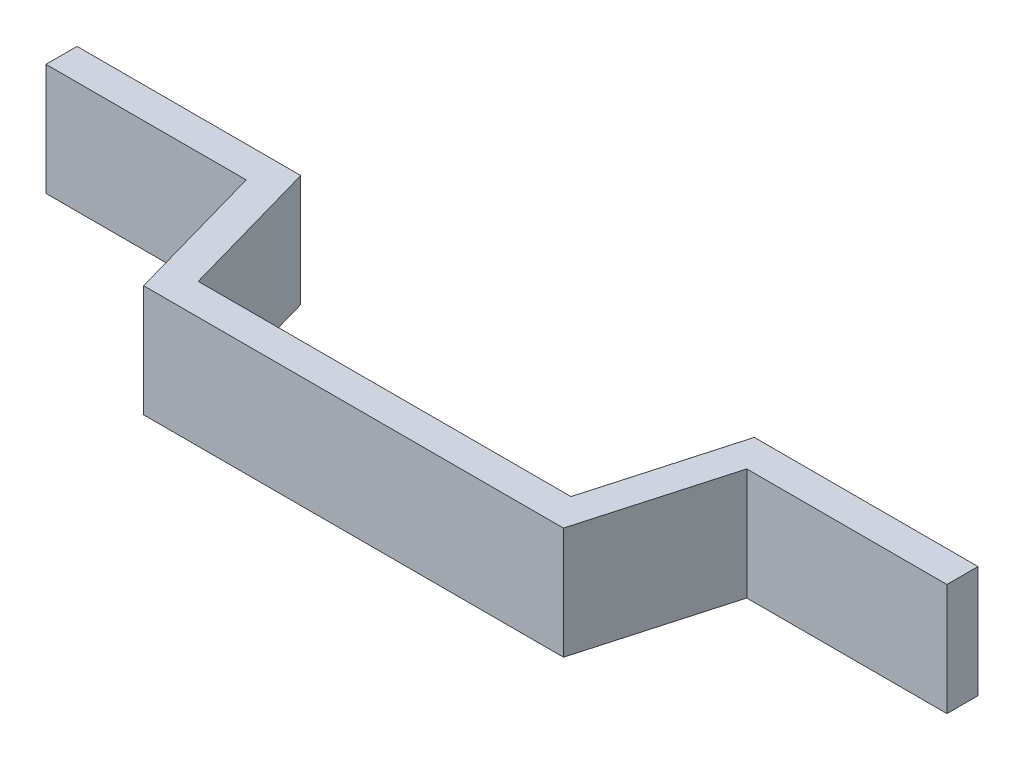
ISO-10303-21;
HEADER;
FILE_DESCRIPTION(('STEP AP214'),'2;1');
FILE_NAME('part.step','',(''),(''),'','','');
FILE_SCHEMA(('AUTOMOTIVE_DESIGN { 1 0 10303 214 1 1 1 1 }'));
ENDSEC;
DATA;
#1=APPLICATION_CONTEXT('core data for automotive mechanical design processes');
#2=APPLICATION_PROTOCOL_DEFINITION('international standard','automotive_design',2000,#1);
#3=PRODUCT_CONTEXT('',#1,'mechanical');
#4=PRODUCT('Part','Part','',(#3));
#5=PRODUCT_RELATED_PRODUCT_CATEGORY('part','',(#4));
#6=PRODUCT_DEFINITION_FORMATION('','',#4);
#7=PRODUCT_DEFINITION_CONTEXT('part definition',#1,'design');
#8=PRODUCT_DEFINITION('design','',#6,#7);
#9=PRODUCT_DEFINITION_SHAPE('','',#8);
#10=(LENGTH_UNIT() NAMED_UNIT(*) SI_UNIT(.MILLI.,.METRE.));
#11=(NAMED_UNIT(*) PLANE_ANGLE_UNIT() SI_UNIT($,.RADIAN.));
#12=(NAMED_UNIT(*) SI_UNIT($,.STERADIAN.) SOLID_ANGLE_UNIT());
#13=UNCERTAINTY_MEASURE_WITH_UNIT(LENGTH_MEASURE(1.E-05),#10,'distance_accuracy_value','');
#14=(GEOMETRIC_REPRESENTATION_CONTEXT(3) GLOBAL_UNCERTAINTY_ASSIGNED_CONTEXT((#13)) GLOBAL_UNIT_ASSIGNED_CONTEXT((#10,
#11,#12)) REPRESENTATION_CONTEXT('',''));
#15=CARTESIAN_POINT('',(0.,0.,0.));
#16=DIRECTION('',(0.,0.,1.));
#17=DIRECTION('',(1.,0.,0.));
#18=AXIS2_PLACEMENT_3D('',#15,#16,#17);
#19=CARTESIAN_POINT('',(-72.5,18.,-23.));
#20=DIRECTION('',(1.,0.,0.));
#21=DIRECTION('',(0.,0.,-1.));
#22=AXIS2_PLACEMENT_3D('',#19,#20,#21);
#23=PLANE('',#22);
#24=DIRECTION('',(0.,0.,1.));
#25=VECTOR('',#24,1.);
#26=CARTESIAN_POINT('',(-72.5,0.,-23.));
#27=LINE('',#26,#25);
#28=CARTESIAN_POINT('',(-72.5,0.,-28.));
#29=VERTEX_POINT('',#28);
#30=CARTESIAN_POINT('',(-72.5,0.,-23.));
#31=VERTEX_POINT('',#30);
#32=EDGE_CURVE('E163',#29,#31,#27,.T.);
#33=ORIENTED_EDGE('',*,*,#32,.T.);
#34=DIRECTION('',(0.,-1.,0.));
#35=VECTOR('',#34,1.);
#36=CARTESIAN_POINT('',(-72.5,18.,-23.));
#37=LINE('',#36,#35);
#38=CARTESIAN_POINT('',(-72.5,18.,-23.));
#39=VERTEX_POINT('',#38);
#40=EDGE_CURVE('E11',#39,#31,#37,.T.);
#41=ORIENTED_EDGE('',*,*,#40,.F.);
#42=DIRECTION('',(0.,0.,1.));
#43=VECTOR('',#42,1.);
#44=CARTESIAN_POINT('',(-72.5,18.,-23.));
#45=LINE('',#44,#43);
#46=CARTESIAN_POINT('',(-72.5,18.,-28.));
#47=VERTEX_POINT('',#46);
#48=EDGE_CURVE('E185',#47,#39,#45,.T.);
#49=ORIENTED_EDGE('',*,*,#48,.F.);
#50=DIRECTION('',(0.,-1.,0.));
#51=VECTOR('',#50,1.);
#52=CARTESIAN_POINT('',(-72.5,18.,-28.));
#53=LINE('',#52,#51);
#54=EDGE_CURVE('E159',#47,#29,#53,.T.);
#55=ORIENTED_EDGE('',*,*,#54,.T.);
#56=EDGE_LOOP('',(#33,#41,#49,#55));
#57=FACE_BOUND('',#56,.T.);
#58=ADVANCED_FACE('F43',(#57),#23,.F.);
#59=CARTESIAN_POINT('',(-40.282790609877,18.,-23.));
#60=DIRECTION('',(0.,0.,-1.));
#61=DIRECTION('',(-1.,0.,0.));
#62=AXIS2_PLACEMENT_3D('',#59,#60,#61);
#63=PLANE('',#62);
#64=DIRECTION('',(1.,0.,0.));
#65=VECTOR('',#64,1.);
#66=CARTESIAN_POINT('',(-40.282790609877,0.,-23.));
#67=LINE('',#66,#65);
#68=CARTESIAN_POINT('',(-40.282790609877,0.,-23.));
#69=VERTEX_POINT('',#68);
#70=EDGE_CURVE('E166',#31,#69,#67,.T.);
#71=ORIENTED_EDGE('',*,*,#70,.T.);
#72=DIRECTION('',(0.,-1.,0.));
#73=VECTOR('',#72,1.);
#74=CARTESIAN_POINT('',(-40.282790609877,18.,-23.));
#75=LINE('',#74,#73);
#76=CARTESIAN_POINT('',(-40.282790609877,18.,-23.));
#77=VERTEX_POINT('',#76);
#78=EDGE_CURVE('E51',#77,#69,#75,.T.);
#79=ORIENTED_EDGE('',*,*,#78,.F.);
#80=DIRECTION('',(1.,0.,0.));
#81=VECTOR('',#80,1.);
#82=CARTESIAN_POINT('',(-40.282790609877,18.,-23.));
#83=LINE('',#82,#81);
#84=EDGE_CURVE('E114',#39,#77,#83,.T.);
#85=ORIENTED_EDGE('',*,*,#84,.F.);
#86=ORIENTED_EDGE('',*,*,#40,.T.);
#87=EDGE_LOOP('',(#71,#79,#85,#86));
#88=FACE_BOUND('',#87,.T.);
#89=ADVANCED_FACE('F263',(#88),#63,.F.);
#90=CARTESIAN_POINT('',(-33.782790609877,18.,0.));
#91=DIRECTION('',(0.962309403107199,0.,-0.271957005225948));
#92=DIRECTION('',(-0.271957005225948,0.,-0.962309403107199));
#93=AXIS2_PLACEMENT_3D('',#90,#91,#92);
#94=PLANE('',#93);
#95=DIRECTION('',(0.271957005225948,0.,0.962309403107199));
#96=VECTOR('',#95,1.);
#97=CARTESIAN_POINT('',(-33.782790609877,0.,0.));
#98=LINE('',#97,#96);
#99=CARTESIAN_POINT('',(-33.782790609877,0.,0.));
#100=VERTEX_POINT('',#99);
#101=EDGE_CURVE('E168',#69,#100,#98,.T.);
#102=ORIENTED_EDGE('',*,*,#101,.T.);
#103=DIRECTION('',(0.,-1.,0.));
#104=VECTOR('',#103,1.);
#105=CARTESIAN_POINT('',(-33.782790609877,18.,0.));
#106=LINE('',#105,#104);
#107=CARTESIAN_POINT('',(-33.782790609877,18.,0.));
#108=VERTEX_POINT('',#107);
#109=EDGE_CURVE('E204',#108,#100,#106,.T.);
#110=ORIENTED_EDGE('',*,*,#109,.F.);
#111=DIRECTION('',(0.271957005225948,0.,0.962309403107199));
#112=VECTOR('',#111,1.);
#113=CARTESIAN_POINT('',(-33.782790609877,18.,0.));
#114=LINE('',#113,#112);
#115=EDGE_CURVE('E212',#77,#108,#114,.T.);
#116=ORIENTED_EDGE('',*,*,#115,.F.);
#117=ORIENTED_EDGE('',*,*,#78,.T.);
#118=EDGE_LOOP('',(#102,#110,#116,#117));
#119=FACE_BOUND('',#118,.T.);
#120=ADVANCED_FACE('F210',(#119),#94,.F.);
#121=CARTESIAN_POINT('',(33.782790609877,18.,0.));
#122=DIRECTION('',(0.,0.,-1.));
#123=DIRECTION('',(-1.,0.,0.));
#124=AXIS2_PLACEMENT_3D('',#121,#122,#123);
#125=PLANE('',#124);
#126=DIRECTION('',(1.,0.,0.));
#127=VECTOR('',#126,1.);
#128=CARTESIAN_POINT('',(33.782790609877,0.,0.));
#129=LINE('',#128,#127);
#130=CARTESIAN_POINT('',(33.782790609877,0.,0.));
#131=VERTEX_POINT('',#130);
#132=EDGE_CURVE('E170',#100,#131,#129,.T.);
#133=ORIENTED_EDGE('',*,*,#132,.T.);
#134=DIRECTION('',(0.,-1.,0.));
#135=VECTOR('',#134,1.);
#136=CARTESIAN_POINT('',(33.782790609877,18.,0.));
#137=LINE('',#136,#135);
#138=CARTESIAN_POINT('',(33.782790609877,18.,0.));
#139=VERTEX_POINT('',#138);
#140=EDGE_CURVE('E201',#139,#131,#137,.T.);
#141=ORIENTED_EDGE('',*,*,#140,.F.);
#142=DIRECTION('',(1.,0.,0.));
#143=VECTOR('',#142,1.);
#144=CARTESIAN_POINT('',(33.782790609877,18.,0.));
#145=LINE('',#144,#143);
#146=EDGE_CURVE('E230',#108,#139,#145,.T.);
#147=ORIENTED_EDGE('',*,*,#146,.F.);
#148=ORIENTED_EDGE('',*,*,#109,.T.);
#149=EDGE_LOOP('',(#133,#141,#147,#148));
#150=FACE_BOUND('',#149,.T.);
#151=ADVANCED_FACE('F221',(#150),#125,.F.);
#152=CARTESIAN_POINT('',(40.282790609877,18.,-23.));
#153=DIRECTION('',(-0.962309403107199,0.,-0.271957005225947));
#154=DIRECTION('',(-0.271957005225947,0.,0.962309403107199));
#155=AXIS2_PLACEMENT_3D('',#152,#153,#154);
#156=PLANE('',#155);
#157=DIRECTION('',(0.271957005225947,0.,-0.962309403107199));
#158=VECTOR('',#157,1.);
#159=CARTESIAN_POINT('',(40.282790609877,0.,-23.));
#160=LINE('',#159,#158);
#161=CARTESIAN_POINT('',(40.282790609877,0.,-23.));
#162=VERTEX_POINT('',#161);
#163=EDGE_CURVE('E172',#131,#162,#160,.T.);
#164=ORIENTED_EDGE('',*,*,#163,.T.);
#165=DIRECTION('',(0.,-1.,0.));
#166=VECTOR('',#165,1.);
#167=CARTESIAN_POINT('',(40.282790609877,18.,-23.));
#168=LINE('',#167,#166);
#169=CARTESIAN_POINT('',(40.282790609877,18.,-23.));
#170=VERTEX_POINT('',#169);
#171=EDGE_CURVE('E198',#170,#162,#168,.T.);
#172=ORIENTED_EDGE('',*,*,#171,.F.);
#173=DIRECTION('',(0.271957005225947,0.,-0.962309403107199));
#174=VECTOR('',#173,1.);
#175=CARTESIAN_POINT('',(40.282790609877,18.,-23.));
#176=LINE('',#175,#174);
#177=EDGE_CURVE('E227',#139,#170,#176,.T.);
#178=ORIENTED_EDGE('',*,*,#177,.F.);
#179=ORIENTED_EDGE('',*,*,#140,.T.);
#180=EDGE_LOOP('',(#164,#172,#178,#179));
#181=FACE_BOUND('',#180,.T.);
#182=ADVANCED_FACE('F225',(#181),#156,.F.);
#183=CARTESIAN_POINT('',(72.5,18.,-23.));
#184=DIRECTION('',(0.,0.,-1.));
#185=DIRECTION('',(-1.,0.,0.));
#186=AXIS2_PLACEMENT_3D('',#183,#184,#185);
#187=PLANE('',#186);
#188=DIRECTION('',(1.,0.,0.));
#189=VECTOR('',#188,1.);
#190=CARTESIAN_POINT('',(72.5,0.,-23.));
#191=LINE('',#190,#189);
#192=CARTESIAN_POINT('',(72.5,0.,-23.));
#193=VERTEX_POINT('',#192);
#194=EDGE_CURVE('E174',#162,#193,#191,.T.);
#195=ORIENTED_EDGE('',*,*,#194,.T.);
#196=DIRECTION('',(0.,-1.,0.));
#197=VECTOR('',#196,1.);
#198=CARTESIAN_POINT('',(72.5,18.,-23.));
#199=LINE('',#198,#197);
#200=CARTESIAN_POINT('',(72.5,18.,-23.));
#201=VERTEX_POINT('',#200);
#202=EDGE_CURVE('E195',#201,#193,#199,.T.);
#203=ORIENTED_EDGE('',*,*,#202,.F.);
#204=DIRECTION('',(1.,0.,0.));
#205=VECTOR('',#204,1.);
#206=CARTESIAN_POINT('',(72.5,18.,-23.));
#207=LINE('',#206,#205);
#208=EDGE_CURVE('E229',#170,#201,#207,.T.);
#209=ORIENTED_EDGE('',*,*,#208,.F.);
#210=ORIENTED_EDGE('',*,*,#171,.T.);
#211=EDGE_LOOP('',(#195,#203,#209,#210));
#212=FACE_BOUND('',#211,.T.);
#213=ADVANCED_FACE('F276',(#212),#187,.F.);
#214=CARTESIAN_POINT('',(72.5,18.,-28.));
#215=DIRECTION('',(-1.,0.,0.));
#216=DIRECTION('',(0.,0.,1.));
#217=AXIS2_PLACEMENT_3D('',#214,#215,#216);
#218=PLANE('',#217);
#219=DIRECTION('',(0.,0.,-1.));
#220=VECTOR('',#219,1.);
#221=CARTESIAN_POINT('',(72.5,0.,-28.));
#222=LINE('',#221,#220);
#223=CARTESIAN_POINT('',(72.5,0.,-28.));
#224=VERTEX_POINT('',#223);
#225=EDGE_CURVE('E176',#193,#224,#222,.T.);
#226=ORIENTED_EDGE('',*,*,#225,.T.);
#227=DIRECTION('',(0.,-1.,0.));
#228=VECTOR('',#227,1.);
#229=CARTESIAN_POINT('',(72.5,18.,-28.));
#230=LINE('',#229,#228);
#231=CARTESIAN_POINT('',(72.5,18.,-28.));
#232=VERTEX_POINT('',#231);
#233=EDGE_CURVE('E192',#232,#224,#230,.T.);
#234=ORIENTED_EDGE('',*,*,#233,.F.);
#235=DIRECTION('',(0.,0.,-1.));
#236=VECTOR('',#235,1.);
#237=CARTESIAN_POINT('',(72.5,18.,-28.));
#238=LINE('',#237,#236);
#239=EDGE_CURVE('E232',#201,#232,#238,.T.);
#240=ORIENTED_EDGE('',*,*,#239,.F.);
#241=ORIENTED_EDGE('',*,*,#202,.T.);
#242=EDGE_LOOP('',(#226,#234,#240,#241));
#243=FACE_BOUND('',#242,.T.);
#244=ADVANCED_FACE('F279',(#243),#218,.F.);
#245=CARTESIAN_POINT('',(36.5,18.,-28.));
#246=DIRECTION('',(0.,0.,1.));
#247=DIRECTION('',(1.,0.,0.));
#248=AXIS2_PLACEMENT_3D('',#245,#246,#247);
#249=PLANE('',#248);
#250=DIRECTION('',(-1.,0.,0.));
#251=VECTOR('',#250,1.);
#252=CARTESIAN_POINT('',(36.5,0.,-28.));
#253=LINE('',#252,#251);
#254=CARTESIAN_POINT('',(36.5,0.,-28.));
#255=VERTEX_POINT('',#254);
#256=EDGE_CURVE('E178',#224,#255,#253,.T.);
#257=ORIENTED_EDGE('',*,*,#256,.T.);
#258=DIRECTION('',(0.,-1.,0.));
#259=VECTOR('',#258,1.);
#260=CARTESIAN_POINT('',(36.5,18.,-28.));
#261=LINE('',#260,#259);
#262=CARTESIAN_POINT('',(36.5,18.,-28.));
#263=VERTEX_POINT('',#262);
#264=EDGE_CURVE('E189',#263,#255,#261,.T.);
#265=ORIENTED_EDGE('',*,*,#264,.F.);
#266=DIRECTION('',(-1.,0.,0.));
#267=VECTOR('',#266,1.);
#268=CARTESIAN_POINT('',(36.5,18.,-28.));
#269=LINE('',#268,#267);
#270=EDGE_CURVE('E238',#232,#263,#269,.T.);
#271=ORIENTED_EDGE('',*,*,#270,.F.);
#272=ORIENTED_EDGE('',*,*,#233,.T.);
#273=EDGE_LOOP('',(#257,#265,#271,#272));
#274=FACE_BOUND('',#273,.T.);
#275=ADVANCED_FACE('F244',(#274),#249,.F.);
#276=CARTESIAN_POINT('',(30.,18.,-5.));
#277=DIRECTION('',(0.962309403107199,0.,0.271957005225948));
#278=DIRECTION('',(0.271957005225948,0.,-0.962309403107199));
#279=AXIS2_PLACEMENT_3D('',#276,#277,#278);
#280=PLANE('',#279);
#281=DIRECTION('',(-0.271957005225948,0.,0.962309403107199));
#282=VECTOR('',#281,1.);
#283=CARTESIAN_POINT('',(30.,0.,-5.));
#284=LINE('',#283,#282);
#285=CARTESIAN_POINT('',(30.,0.,-5.));
#286=VERTEX_POINT('',#285);
#287=EDGE_CURVE('E180',#255,#286,#284,.T.);
#288=ORIENTED_EDGE('',*,*,#287,.T.);
#289=DIRECTION('',(0.,-1.,0.));
#290=VECTOR('',#289,1.);
#291=CARTESIAN_POINT('',(30.,18.,-5.));
#292=LINE('',#291,#290);
#293=CARTESIAN_POINT('',(30.,18.,-5.));
#294=VERTEX_POINT('',#293);
#295=EDGE_CURVE('E154',#294,#286,#292,.T.);
#296=ORIENTED_EDGE('',*,*,#295,.F.);
#297=DIRECTION('',(-0.271957005225948,0.,0.962309403107199));
#298=VECTOR('',#297,1.);
#299=CARTESIAN_POINT('',(30.,18.,-5.));
#300=LINE('',#299,#298);
#301=EDGE_CURVE('E145',#263,#294,#300,.T.);
#302=ORIENTED_EDGE('',*,*,#301,.F.);
#303=ORIENTED_EDGE('',*,*,#264,.T.);
#304=EDGE_LOOP('',(#288,#296,#302,#303));
#305=FACE_BOUND('',#304,.T.);
#306=ADVANCED_FACE('F248',(#305),#280,.F.);
#307=CARTESIAN_POINT('',(-30.,18.,-5.00000000000001));
#308=DIRECTION('',(0.,0.,1.));
#309=DIRECTION('',(1.,0.,0.));
#310=AXIS2_PLACEMENT_3D('',#307,#308,#309);
#311=PLANE('',#310);
#312=DIRECTION('',(-1.,0.,0.));
#313=VECTOR('',#312,1.);
#314=CARTESIAN_POINT('',(-30.,0.,-5.00000000000001));
#315=LINE('',#314,#313);
#316=CARTESIAN_POINT('',(-30.,0.,-5.00000000000001));
#317=VERTEX_POINT('',#316);
#318=EDGE_CURVE('E153',#286,#317,#315,.T.);
#319=ORIENTED_EDGE('',*,*,#318,.T.);
#320=DIRECTION('',(0.,-1.,0.));
#321=VECTOR('',#320,1.);
#322=CARTESIAN_POINT('',(-30.,18.,-5.00000000000001));
#323=LINE('',#322,#321);
#324=CARTESIAN_POINT('',(-30.,18.,-5.00000000000001));
#325=VERTEX_POINT('',#324);
#326=EDGE_CURVE('E150',#325,#317,#323,.T.);
#327=ORIENTED_EDGE('',*,*,#326,.F.);
#328=DIRECTION('',(-1.,0.,0.));
#329=VECTOR('',#328,1.);
#330=CARTESIAN_POINT('',(-30.,18.,-5.00000000000001));
#331=LINE('',#330,#329);
#332=EDGE_CURVE('E139',#294,#325,#331,.T.);
#333=ORIENTED_EDGE('',*,*,#332,.F.);
#334=ORIENTED_EDGE('',*,*,#295,.T.);
#335=EDGE_LOOP('',(#319,#327,#333,#334));
#336=FACE_BOUND('',#335,.T.);
#337=ADVANCED_FACE('F151',(#336),#311,.F.);
#338=CARTESIAN_POINT('',(-36.5,18.,-28.));
#339=DIRECTION('',(-0.962309403107199,0.,0.271957005225948));
#340=DIRECTION('',(0.271957005225948,0.,0.962309403107199));
#341=AXIS2_PLACEMENT_3D('',#338,#339,#340);
#342=PLANE('',#341);
#343=DIRECTION('',(-0.271957005225948,0.,-0.962309403107199));
#344=VECTOR('',#343,1.);
#345=CARTESIAN_POINT('',(-36.5,0.,-28.));
#346=LINE('',#345,#344);
#347=CARTESIAN_POINT('',(-36.5,0.,-28.));
#348=VERTEX_POINT('',#347);
#349=EDGE_CURVE('E100',#317,#348,#346,.T.);
#350=ORIENTED_EDGE('',*,*,#349,.T.);
#351=DIRECTION('',(0.,-1.,0.));
#352=VECTOR('',#351,1.);
#353=CARTESIAN_POINT('',(-36.5,18.,-28.));
#354=LINE('',#353,#352);
#355=CARTESIAN_POINT('',(-36.5,18.,-28.));
#356=VERTEX_POINT('',#355);
#357=EDGE_CURVE('E155',#356,#348,#354,.T.);
#358=ORIENTED_EDGE('',*,*,#357,.F.);
#359=DIRECTION('',(-0.271957005225948,0.,-0.962309403107199));
#360=VECTOR('',#359,1.);
#361=CARTESIAN_POINT('',(-36.5,18.,-28.));
#362=LINE('',#361,#360);
#363=EDGE_CURVE('E143',#325,#356,#362,.T.);
#364=ORIENTED_EDGE('',*,*,#363,.F.);
#365=ORIENTED_EDGE('',*,*,#326,.T.);
#366=EDGE_LOOP('',(#350,#358,#364,#365));
#367=FACE_BOUND('',#366,.T.);
#368=ADVANCED_FACE('F157',(#367),#342,.F.);
#369=CARTESIAN_POINT('',(-72.5,18.,-28.));
#370=DIRECTION('',(0.,0.,1.));
#371=DIRECTION('',(1.,0.,0.));
#372=AXIS2_PLACEMENT_3D('',#369,#370,#371);
#373=PLANE('',#372);
#374=DIRECTION('',(-1.,0.,0.));
#375=VECTOR('',#374,1.);
#376=CARTESIAN_POINT('',(-72.5,0.,-28.));
#377=LINE('',#376,#375);
#378=EDGE_CURVE('E106',#348,#29,#377,.T.);
#379=ORIENTED_EDGE('',*,*,#378,.T.);
#380=ORIENTED_EDGE('',*,*,#54,.F.);
#381=DIRECTION('',(-1.,0.,0.));
#382=VECTOR('',#381,1.);
#383=CARTESIAN_POINT('',(-72.5,18.,-28.));
#384=LINE('',#383,#382);
#385=EDGE_CURVE('E59',#356,#47,#384,.T.);
#386=ORIENTED_EDGE('',*,*,#385,.F.);
#387=ORIENTED_EDGE('',*,*,#357,.T.);
#388=EDGE_LOOP('',(#379,#380,#386,#387));
#389=FACE_BOUND('',#388,.T.);
#390=ADVANCED_FACE('F252',(#389),#373,.F.);
#391=CARTESIAN_POINT('',(0.,18.,0.));
#392=DIRECTION('',(0.,-1.,0.));
#393=DIRECTION('',(0.,0.,-1.));
#394=AXIS2_PLACEMENT_3D('',#391,#392,#393);
#395=PLANE('',#394);
#396=ORIENTED_EDGE('',*,*,#48,.T.);
#397=ORIENTED_EDGE('',*,*,#84,.T.);
#398=ORIENTED_EDGE('',*,*,#115,.T.);
#399=ORIENTED_EDGE('',*,*,#146,.T.);
#400=ORIENTED_EDGE('',*,*,#177,.T.);
#401=ORIENTED_EDGE('',*,*,#208,.T.);
#402=ORIENTED_EDGE('',*,*,#239,.T.);
#403=ORIENTED_EDGE('',*,*,#270,.T.);
#404=ORIENTED_EDGE('',*,*,#301,.T.);
#405=ORIENTED_EDGE('',*,*,#332,.T.);
#406=ORIENTED_EDGE('',*,*,#363,.T.);
#407=ORIENTED_EDGE('',*,*,#385,.T.);
#408=EDGE_LOOP('',(#396,#397,#398,#399,#400,#401,#402,#403,#404,#405,#406,#407));
#409=FACE_BOUND('',#408,.T.);
#410=ADVANCED_FACE('F141',(#409),#395,.F.);
#411=CARTESIAN_POINT('',(0.,0.,0.));
#412=DIRECTION('',(0.,-1.,0.));
#413=DIRECTION('',(0.,0.,-1.));
#414=AXIS2_PLACEMENT_3D('',#411,#412,#413);
#415=PLANE('',#414);
#416=ORIENTED_EDGE('',*,*,#32,.F.);
#417=ORIENTED_EDGE('',*,*,#378,.F.);
#418=ORIENTED_EDGE('',*,*,#349,.F.);
#419=ORIENTED_EDGE('',*,*,#318,.F.);
#420=ORIENTED_EDGE('',*,*,#287,.F.);
#421=ORIENTED_EDGE('',*,*,#256,.F.);
#422=ORIENTED_EDGE('',*,*,#225,.F.);
#423=ORIENTED_EDGE('',*,*,#194,.F.);
#424=ORIENTED_EDGE('',*,*,#163,.F.);
#425=ORIENTED_EDGE('',*,*,#132,.F.);
#426=ORIENTED_EDGE('',*,*,#101,.F.);
#427=ORIENTED_EDGE('',*,*,#70,.F.);
#428=EDGE_LOOP('',(#416,#417,#418,#419,#420,#421,#422,#423,#424,#425,#426,#427));
#429=FACE_BOUND('',#428,.T.);
#430=ADVANCED_FACE('F216',(#429),#415,.T.);
#431=CLOSED_SHELL('',(#58,#89,#120,#151,#182,#213,#244,#275,#306,#337,#368,#390,#410,#430));
#432=MANIFOLD_SOLID_BREP('B2',#431);
#433=ADVANCED_BREP_SHAPE_REPRESENTATION('',(#18,#432),#14);
#434=SHAPE_DEFINITION_REPRESENTATION(#9,#433);
ENDSEC;
END-ISO-10303-21;
